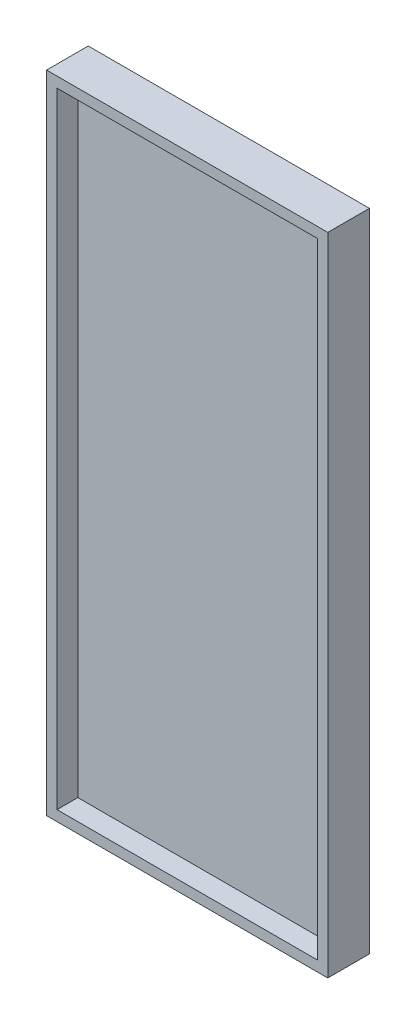
ISO-10303-21;
HEADER;
FILE_DESCRIPTION(('STEP AP214'),'2;1');
FILE_NAME('part.step','',(''),(''),'','','');
FILE_SCHEMA(('AUTOMOTIVE_DESIGN { 1 0 10303 214 1 1 1 1 }'));
ENDSEC;
DATA;
#1=APPLICATION_CONTEXT('core data for automotive mechanical design processes');
#2=APPLICATION_PROTOCOL_DEFINITION('international standard','automotive_design',2000,#1);
#3=PRODUCT_CONTEXT('',#1,'mechanical');
#4=PRODUCT('Part','Part','',(#3));
#5=PRODUCT_RELATED_PRODUCT_CATEGORY('part','',(#4));
#6=PRODUCT_DEFINITION_FORMATION('','',#4);
#7=PRODUCT_DEFINITION_CONTEXT('part definition',#1,'design');
#8=PRODUCT_DEFINITION('design','',#6,#7);
#9=PRODUCT_DEFINITION_SHAPE('','',#8);
#10=(LENGTH_UNIT() NAMED_UNIT(*) SI_UNIT(.MILLI.,.METRE.));
#11=(NAMED_UNIT(*) PLANE_ANGLE_UNIT() SI_UNIT($,.RADIAN.));
#12=(NAMED_UNIT(*) SI_UNIT($,.STERADIAN.) SOLID_ANGLE_UNIT());
#13=UNCERTAINTY_MEASURE_WITH_UNIT(LENGTH_MEASURE(1.E-05),#10,'distance_accuracy_value','');
#14=(GEOMETRIC_REPRESENTATION_CONTEXT(3) GLOBAL_UNCERTAINTY_ASSIGNED_CONTEXT((#13)) GLOBAL_UNIT_ASSIGNED_CONTEXT((#10,
#11,#12)) REPRESENTATION_CONTEXT('',''));
#15=CARTESIAN_POINT('',(0.,0.,0.));
#16=DIRECTION('',(0.,0.,1.));
#17=DIRECTION('',(1.,0.,0.));
#18=AXIS2_PLACEMENT_3D('',#15,#16,#17);
#19=CARTESIAN_POINT('',(13.5,31.,2.));
#20=DIRECTION('',(-1.,0.,0.));
#21=DIRECTION('',(0.,-1.,0.));
#22=AXIS2_PLACEMENT_3D('',#19,#20,#21);
#23=PLANE('',#22);
#24=DIRECTION('',(0.,1.,0.));
#25=VECTOR('',#24,1.);
#26=CARTESIAN_POINT('',(13.5,31.,0.));
#27=LINE('',#26,#25);
#28=CARTESIAN_POINT('',(13.5,-31.,0.));
#29=VERTEX_POINT('',#28);
#30=CARTESIAN_POINT('',(13.5,31.,0.));
#31=VERTEX_POINT('',#30);
#32=EDGE_CURVE('E191',#29,#31,#27,.T.);
#33=ORIENTED_EDGE('',*,*,#32,.T.);
#34=DIRECTION('',(0.,0.,-1.));
#35=VECTOR('',#34,1.);
#36=CARTESIAN_POINT('',(13.5,31.,2.));
#37=LINE('',#36,#35);
#38=CARTESIAN_POINT('',(13.5,31.,4.));
#39=VERTEX_POINT('',#38);
#40=EDGE_CURVE('E12',#39,#31,#37,.T.);
#41=ORIENTED_EDGE('',*,*,#40,.F.);
#42=DIRECTION('',(0.,-1.,0.));
#43=VECTOR('',#42,1.);
#44=CARTESIAN_POINT('',(13.5,31.,4.));
#45=LINE('',#44,#43);
#46=CARTESIAN_POINT('',(13.5,-31.,4.));
#47=VERTEX_POINT('',#46);
#48=EDGE_CURVE('E179',#39,#47,#45,.T.);
#49=ORIENTED_EDGE('',*,*,#48,.T.);
#50=DIRECTION('',(0.,0.,-1.));
#51=VECTOR('',#50,1.);
#52=CARTESIAN_POINT('',(13.5,-31.,2.));
#53=LINE('',#52,#51);
#54=EDGE_CURVE('E204',#47,#29,#53,.T.);
#55=ORIENTED_EDGE('',*,*,#54,.T.);
#56=EDGE_LOOP('',(#33,#41,#49,#55));
#57=FACE_BOUND('',#56,.T.);
#58=ADVANCED_FACE('F63',(#57),#23,.F.);
#59=CARTESIAN_POINT('',(-13.5,31.,2.));
#60=DIRECTION('',(0.,-1.,0.));
#61=DIRECTION('',(0.,0.,-1.));
#62=AXIS2_PLACEMENT_3D('',#59,#60,#61);
#63=PLANE('',#62);
#64=DIRECTION('',(-1.,0.,0.));
#65=VECTOR('',#64,1.);
#66=CARTESIAN_POINT('',(-13.5,31.,0.));
#67=LINE('',#66,#65);
#68=CARTESIAN_POINT('',(-13.5,31.,0.));
#69=VERTEX_POINT('',#68);
#70=EDGE_CURVE('E195',#31,#69,#67,.T.);
#71=ORIENTED_EDGE('',*,*,#70,.T.);
#72=DIRECTION('',(0.,0.,-1.));
#73=VECTOR('',#72,1.);
#74=CARTESIAN_POINT('',(-13.5,31.,2.));
#75=LINE('',#74,#73);
#76=CARTESIAN_POINT('',(-13.5,31.,4.));
#77=VERTEX_POINT('',#76);
#78=EDGE_CURVE('E71',#77,#69,#75,.T.);
#79=ORIENTED_EDGE('',*,*,#78,.F.);
#80=DIRECTION('',(1.,0.,0.));
#81=VECTOR('',#80,1.);
#82=CARTESIAN_POINT('',(-13.5,31.,4.));
#83=LINE('',#82,#81);
#84=EDGE_CURVE('E183',#77,#39,#83,.T.);
#85=ORIENTED_EDGE('',*,*,#84,.T.);
#86=ORIENTED_EDGE('',*,*,#40,.T.);
#87=EDGE_LOOP('',(#71,#79,#85,#86));
#88=FACE_BOUND('',#87,.T.);
#89=ADVANCED_FACE('F229',(#88),#63,.F.);
#90=CARTESIAN_POINT('',(-13.5,31.,2.));
#91=DIRECTION('',(1.,0.,0.));
#92=DIRECTION('',(0.,1.,0.));
#93=AXIS2_PLACEMENT_3D('',#90,#91,#92);
#94=PLANE('',#93);
#95=DIRECTION('',(0.,-1.,0.));
#96=VECTOR('',#95,1.);
#97=CARTESIAN_POINT('',(-13.5,31.,0.));
#98=LINE('',#97,#96);
#99=CARTESIAN_POINT('',(-13.5,-31.,0.));
#100=VERTEX_POINT('',#99);
#101=EDGE_CURVE('E198',#69,#100,#98,.T.);
#102=ORIENTED_EDGE('',*,*,#101,.T.);
#103=DIRECTION('',(0.,0.,-1.));
#104=VECTOR('',#103,1.);
#105=CARTESIAN_POINT('',(-13.5,-31.,2.));
#106=LINE('',#105,#104);
#107=CARTESIAN_POINT('',(-13.5,-31.,4.));
#108=VERTEX_POINT('',#107);
#109=EDGE_CURVE('E208',#108,#100,#106,.T.);
#110=ORIENTED_EDGE('',*,*,#109,.F.);
#111=DIRECTION('',(0.,-1.,0.));
#112=VECTOR('',#111,1.);
#113=CARTESIAN_POINT('',(-13.5,31.,4.));
#114=LINE('',#113,#112);
#115=EDGE_CURVE('E187',#77,#108,#114,.T.);
#116=ORIENTED_EDGE('',*,*,#115,.F.);
#117=ORIENTED_EDGE('',*,*,#78,.T.);
#118=EDGE_LOOP('',(#102,#110,#116,#117));
#119=FACE_BOUND('',#118,.T.);
#120=ADVANCED_FACE('F216',(#119),#94,.F.);
#121=CARTESIAN_POINT('',(-13.5,-31.,2.));
#122=DIRECTION('',(0.,1.,0.));
#123=DIRECTION('',(0.,0.,1.));
#124=AXIS2_PLACEMENT_3D('',#121,#122,#123);
#125=PLANE('',#124);
#126=DIRECTION('',(1.,0.,0.));
#127=VECTOR('',#126,1.);
#128=CARTESIAN_POINT('',(-13.5,-31.,0.));
#129=LINE('',#128,#127);
#130=EDGE_CURVE('E201',#100,#29,#129,.T.);
#131=ORIENTED_EDGE('',*,*,#130,.T.);
#132=ORIENTED_EDGE('',*,*,#54,.F.);
#133=DIRECTION('',(1.,0.,0.));
#134=VECTOR('',#133,1.);
#135=CARTESIAN_POINT('',(-13.5,-31.,4.));
#136=LINE('',#135,#134);
#137=EDGE_CURVE('E145',#108,#47,#136,.T.);
#138=ORIENTED_EDGE('',*,*,#137,.F.);
#139=ORIENTED_EDGE('',*,*,#109,.T.);
#140=EDGE_LOOP('',(#131,#132,#138,#139));
#141=FACE_BOUND('',#140,.T.);
#142=ADVANCED_FACE('F224',(#141),#125,.F.);
#143=CARTESIAN_POINT('',(0.,0.,0.));
#144=DIRECTION('',(0.,0.,1.));
#145=DIRECTION('',(1.,0.,0.));
#146=AXIS2_PLACEMENT_3D('',#143,#144,#145);
#147=PLANE('',#146);
#148=ORIENTED_EDGE('',*,*,#32,.F.);
#149=ORIENTED_EDGE('',*,*,#130,.F.);
#150=ORIENTED_EDGE('',*,*,#101,.F.);
#151=ORIENTED_EDGE('',*,*,#70,.F.);
#152=EDGE_LOOP('',(#148,#149,#150,#151));
#153=FACE_BOUND('',#152,.T.);
#154=ADVANCED_FACE('F222',(#153),#147,.F.);
#155=CARTESIAN_POINT('',(0.,0.,4.));
#156=DIRECTION('',(0.,0.,-1.));
#157=DIRECTION('',(-1.,0.,0.));
#158=AXIS2_PLACEMENT_3D('',#155,#156,#157);
#159=PLANE('',#158);
#160=ORIENTED_EDGE('',*,*,#137,.T.);
#161=ORIENTED_EDGE('',*,*,#48,.F.);
#162=ORIENTED_EDGE('',*,*,#84,.F.);
#163=ORIENTED_EDGE('',*,*,#115,.T.);
#164=EDGE_LOOP('',(#160,#161,#162,#163));
#165=FACE_BOUND('',#164,.T.);
#166=DIRECTION('',(1.,0.,0.));
#167=VECTOR('',#166,1.);
#168=CARTESIAN_POINT('',(-12.5,-30.,4.));
#169=LINE('',#168,#167);
#170=CARTESIAN_POINT('',(-12.5,-30.,4.));
#171=VERTEX_POINT('',#170);
#172=CARTESIAN_POINT('',(12.5,-30.,4.));
#173=VERTEX_POINT('',#172);
#174=EDGE_CURVE('E127',#171,#173,#169,.T.);
#175=ORIENTED_EDGE('',*,*,#174,.F.);
#176=DIRECTION('',(0.,-1.,0.));
#177=VECTOR('',#176,1.);
#178=CARTESIAN_POINT('',(-12.5,30.,4.));
#179=LINE('',#178,#177);
#180=CARTESIAN_POINT('',(-12.5,30.,4.));
#181=VERTEX_POINT('',#180);
#182=EDGE_CURVE('E153',#181,#171,#179,.T.);
#183=ORIENTED_EDGE('',*,*,#182,.F.);
#184=DIRECTION('',(1.,0.,0.));
#185=VECTOR('',#184,1.);
#186=CARTESIAN_POINT('',(-12.5,30.,4.));
#187=LINE('',#186,#185);
#188=CARTESIAN_POINT('',(12.5,30.,4.));
#189=VERTEX_POINT('',#188);
#190=EDGE_CURVE('E149',#181,#189,#187,.T.);
#191=ORIENTED_EDGE('',*,*,#190,.T.);
#192=DIRECTION('',(0.,-1.,0.));
#193=VECTOR('',#192,1.);
#194=CARTESIAN_POINT('',(12.5,30.,4.));
#195=LINE('',#194,#193);
#196=EDGE_CURVE('E137',#189,#173,#195,.T.);
#197=ORIENTED_EDGE('',*,*,#196,.T.);
#198=EDGE_LOOP('',(#175,#183,#191,#197));
#199=FACE_BOUND('',#198,.T.);
#200=ADVANCED_FACE('F148',(#165,#199),#159,.F.);
#201=CARTESIAN_POINT('',(-12.5,-30.,4.));
#202=DIRECTION('',(0.,1.,0.));
#203=DIRECTION('',(0.,0.,1.));
#204=AXIS2_PLACEMENT_3D('',#201,#202,#203);
#205=PLANE('',#204);
#206=DIRECTION('',(1.,0.,0.));
#207=VECTOR('',#206,1.);
#208=CARTESIAN_POINT('',(-12.5,-30.,2.));
#209=LINE('',#208,#207);
#210=CARTESIAN_POINT('',(-12.5,-30.,2.));
#211=VERTEX_POINT('',#210);
#212=CARTESIAN_POINT('',(12.5,-30.,2.));
#213=VERTEX_POINT('',#212);
#214=EDGE_CURVE('E78',#211,#213,#209,.T.);
#215=ORIENTED_EDGE('',*,*,#214,.F.);
#216=DIRECTION('',(0.,0.,-1.));
#217=VECTOR('',#216,1.);
#218=CARTESIAN_POINT('',(-12.5,-30.,4.));
#219=LINE('',#218,#217);
#220=EDGE_CURVE('E132',#171,#211,#219,.T.);
#221=ORIENTED_EDGE('',*,*,#220,.F.);
#222=ORIENTED_EDGE('',*,*,#174,.T.);
#223=DIRECTION('',(0.,0.,-1.));
#224=VECTOR('',#223,1.);
#225=CARTESIAN_POINT('',(12.5,-30.,4.));
#226=LINE('',#225,#224);
#227=EDGE_CURVE('E130',#173,#213,#226,.T.);
#228=ORIENTED_EDGE('',*,*,#227,.T.);
#229=EDGE_LOOP('',(#215,#221,#222,#228));
#230=FACE_BOUND('',#229,.T.);
#231=ADVANCED_FACE('F129',(#230),#205,.T.);
#232=CARTESIAN_POINT('',(12.5,30.,4.));
#233=DIRECTION('',(1.,0.,0.));
#234=DIRECTION('',(0.,0.,-1.));
#235=AXIS2_PLACEMENT_3D('',#232,#233,#234);
#236=PLANE('',#235);
#237=DIRECTION('',(0.,-1.,0.));
#238=VECTOR('',#237,1.);
#239=CARTESIAN_POINT('',(12.5,30.,2.));
#240=LINE('',#239,#238);
#241=CARTESIAN_POINT('',(12.5,30.,2.));
#242=VERTEX_POINT('',#241);
#243=EDGE_CURVE('E83',#242,#213,#240,.T.);
#244=ORIENTED_EDGE('',*,*,#243,.T.);
#245=ORIENTED_EDGE('',*,*,#227,.F.);
#246=ORIENTED_EDGE('',*,*,#196,.F.);
#247=DIRECTION('',(0.,0.,-1.));
#248=VECTOR('',#247,1.);
#249=CARTESIAN_POINT('',(12.5,30.,4.));
#250=LINE('',#249,#248);
#251=EDGE_CURVE('E146',#189,#242,#250,.T.);
#252=ORIENTED_EDGE('',*,*,#251,.T.);
#253=EDGE_LOOP('',(#244,#245,#246,#252));
#254=FACE_BOUND('',#253,.T.);
#255=ADVANCED_FACE('F142',(#254),#236,.F.);
#256=CARTESIAN_POINT('',(-12.5,30.,4.));
#257=DIRECTION('',(0.,1.,0.));
#258=DIRECTION('',(0.,0.,1.));
#259=AXIS2_PLACEMENT_3D('',#256,#257,#258);
#260=PLANE('',#259);
#261=DIRECTION('',(1.,0.,0.));
#262=VECTOR('',#261,1.);
#263=CARTESIAN_POINT('',(-12.5,30.,2.));
#264=LINE('',#263,#262);
#265=CARTESIAN_POINT('',(-12.5,30.,2.));
#266=VERTEX_POINT('',#265);
#267=EDGE_CURVE('E162',#266,#242,#264,.T.);
#268=ORIENTED_EDGE('',*,*,#267,.T.);
#269=ORIENTED_EDGE('',*,*,#251,.F.);
#270=ORIENTED_EDGE('',*,*,#190,.F.);
#271=DIRECTION('',(0.,0.,-1.));
#272=VECTOR('',#271,1.);
#273=CARTESIAN_POINT('',(-12.5,30.,4.));
#274=LINE('',#273,#272);
#275=EDGE_CURVE('E170',#181,#266,#274,.T.);
#276=ORIENTED_EDGE('',*,*,#275,.T.);
#277=EDGE_LOOP('',(#268,#269,#270,#276));
#278=FACE_BOUND('',#277,.T.);
#279=ADVANCED_FACE('F251',(#278),#260,.F.);
#280=CARTESIAN_POINT('',(-12.5,30.,4.));
#281=DIRECTION('',(1.,0.,0.));
#282=DIRECTION('',(0.,0.,-1.));
#283=AXIS2_PLACEMENT_3D('',#280,#281,#282);
#284=PLANE('',#283);
#285=DIRECTION('',(0.,-1.,0.));
#286=VECTOR('',#285,1.);
#287=CARTESIAN_POINT('',(-12.5,30.,2.));
#288=LINE('',#287,#286);
#289=EDGE_CURVE('E138',#266,#211,#288,.T.);
#290=ORIENTED_EDGE('',*,*,#289,.F.);
#291=ORIENTED_EDGE('',*,*,#275,.F.);
#292=ORIENTED_EDGE('',*,*,#182,.T.);
#293=ORIENTED_EDGE('',*,*,#220,.T.);
#294=EDGE_LOOP('',(#290,#291,#292,#293));
#295=FACE_BOUND('',#294,.T.);
#296=ADVANCED_FACE('F244',(#295),#284,.T.);
#297=CARTESIAN_POINT('',(0.,0.,2.));
#298=DIRECTION('',(0.,0.,1.));
#299=DIRECTION('',(1.,0.,0.));
#300=AXIS2_PLACEMENT_3D('',#297,#298,#299);
#301=PLANE('',#300);
#302=ORIENTED_EDGE('',*,*,#214,.T.);
#303=ORIENTED_EDGE('',*,*,#243,.F.);
#304=ORIENTED_EDGE('',*,*,#267,.F.);
#305=ORIENTED_EDGE('',*,*,#289,.T.);
#306=EDGE_LOOP('',(#302,#303,#304,#305));
#307=FACE_BOUND('',#306,.T.);
#308=ADVANCED_FACE('F241',(#307),#301,.T.);
#309=CLOSED_SHELL('',(#58,#89,#120,#142,#154,#200,#231,#255,#279,#296,#308));
#310=MANIFOLD_SOLID_BREP('B2',#309);
#311=ADVANCED_BREP_SHAPE_REPRESENTATION('',(#18,#310),#14);
#312=SHAPE_DEFINITION_REPRESENTATION(#9,#311);
ENDSEC;
END-ISO-10303-21;
